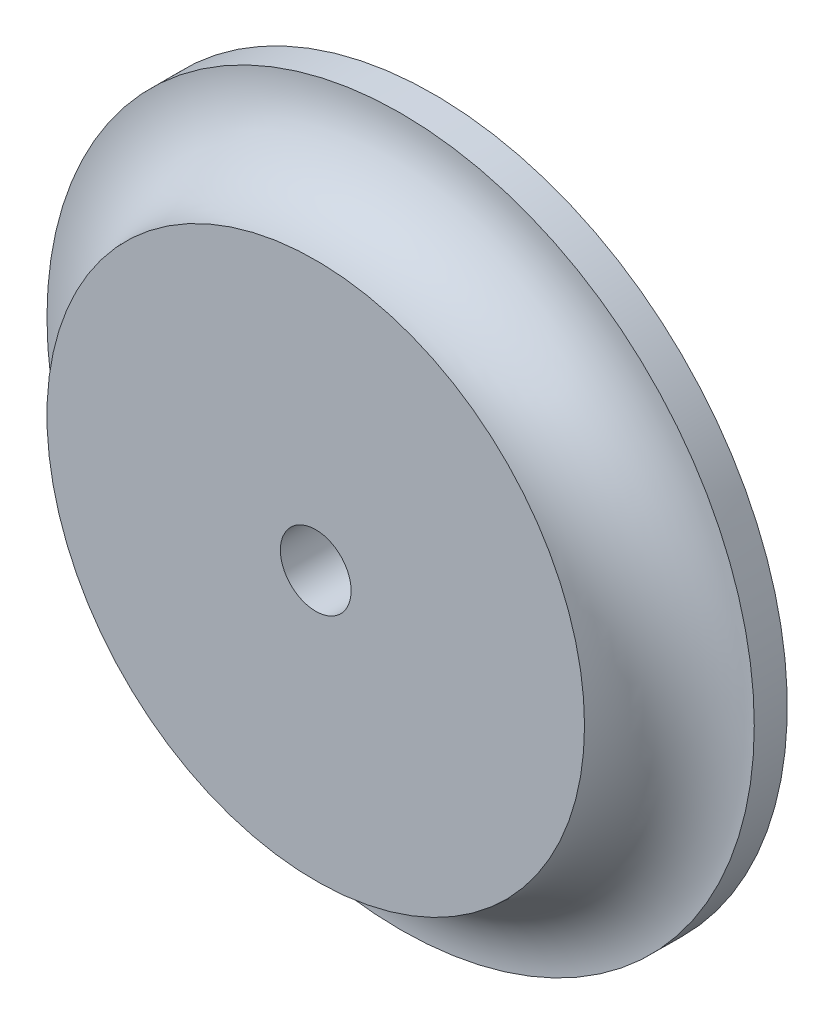
ISO-10303-21;
HEADER;
FILE_DESCRIPTION(('STEP AP214'),'2;1');
FILE_NAME('part.step','',(''),(''),'','','');
FILE_SCHEMA(('AUTOMOTIVE_DESIGN { 1 0 10303 214 1 1 1 1 }'));
ENDSEC;
DATA;
#1=APPLICATION_CONTEXT('core data for automotive mechanical design processes');
#2=APPLICATION_PROTOCOL_DEFINITION('international standard','automotive_design',2000,#1);
#3=PRODUCT_CONTEXT('',#1,'mechanical');
#4=PRODUCT('Part','Part','',(#3));
#5=PRODUCT_RELATED_PRODUCT_CATEGORY('part','',(#4));
#6=PRODUCT_DEFINITION_FORMATION('','',#4);
#7=PRODUCT_DEFINITION_CONTEXT('part definition',#1,'design');
#8=PRODUCT_DEFINITION('design','',#6,#7);
#9=PRODUCT_DEFINITION_SHAPE('','',#8);
#10=(LENGTH_UNIT() NAMED_UNIT(*) SI_UNIT(.MILLI.,.METRE.));
#11=(NAMED_UNIT(*) PLANE_ANGLE_UNIT() SI_UNIT($,.RADIAN.));
#12=(NAMED_UNIT(*) SI_UNIT($,.STERADIAN.) SOLID_ANGLE_UNIT());
#13=UNCERTAINTY_MEASURE_WITH_UNIT(LENGTH_MEASURE(1.E-05),#10,'distance_accuracy_value','');
#14=(GEOMETRIC_REPRESENTATION_CONTEXT(3) GLOBAL_UNCERTAINTY_ASSIGNED_CONTEXT((#13)) GLOBAL_UNIT_ASSIGNED_CONTEXT((#10,
#11,#12)) REPRESENTATION_CONTEXT('',''));
#15=CARTESIAN_POINT('',(0.,0.,0.));
#16=DIRECTION('',(0.,0.,1.));
#17=DIRECTION('',(1.,0.,0.));
#18=AXIS2_PLACEMENT_3D('',#15,#16,#17);
#19=CARTESIAN_POINT('',(0.,0.,-9.144));
#20=DIRECTION('',(0.,0.,1.));
#21=DIRECTION('',(1.,0.,0.));
#22=AXIS2_PLACEMENT_3D('',#19,#20,#21);
#23=TOROIDAL_SURFACE('',#22,38.1,9.144);
#24=CARTESIAN_POINT('',(0.,0.,-9.144));
#25=DIRECTION('',(0.,0.,1.));
#26=DIRECTION('',(1.,0.,0.));
#27=AXIS2_PLACEMENT_3D('',#24,#25,#26);
#28=CIRCLE('',#27,28.956);
#29=CARTESIAN_POINT('',(28.956,0.,-9.144));
#30=VERTEX_POINT('',#29);
#31=EDGE_CURVE('E59',#30,#30,#28,.F.);
#32=ORIENTED_EDGE('',*,*,#31,.T.);
#33=EDGE_LOOP('',(#32));
#34=FACE_BOUND('',#33,.T.);
#35=CARTESIAN_POINT('',(0.,0.,-18.288));
#36=DIRECTION('',(0.,0.,-1.));
#37=DIRECTION('',(-1.,0.,0.));
#38=AXIS2_PLACEMENT_3D('',#35,#36,#37);
#39=CIRCLE('',#38,38.1);
#40=CARTESIAN_POINT('',(-38.1,0.,-18.288));
#41=VERTEX_POINT('',#40);
#42=EDGE_CURVE('E48',#41,#41,#39,.T.);
#43=ORIENTED_EDGE('',*,*,#42,.F.);
#44=EDGE_LOOP('',(#43));
#45=FACE_BOUND('',#44,.T.);
#46=ADVANCED_FACE('F40',(#34,#45),#23,.F.);
#47=CARTESIAN_POINT('',(0.,0.,-21.844));
#48=DIRECTION('',(0.,0.,1.));
#49=DIRECTION('',(1.,0.,0.));
#50=AXIS2_PLACEMENT_3D('',#47,#48,#49);
#51=CYLINDRICAL_SURFACE('',#50,38.1);
#52=CARTESIAN_POINT('',(0.,0.,-21.844));
#53=DIRECTION('',(0.,0.,-1.));
#54=DIRECTION('',(-1.,0.,0.));
#55=AXIS2_PLACEMENT_3D('',#52,#53,#54);
#56=CIRCLE('',#55,38.1);
#57=CARTESIAN_POINT('',(-38.1,0.,-21.844));
#58=VERTEX_POINT('',#57);
#59=EDGE_CURVE('E10',#58,#58,#56,.T.);
#60=ORIENTED_EDGE('',*,*,#59,.F.);
#61=EDGE_LOOP('',(#60));
#62=FACE_BOUND('',#61,.T.);
#63=ORIENTED_EDGE('',*,*,#42,.T.);
#64=EDGE_LOOP('',(#63));
#65=FACE_BOUND('',#64,.T.);
#66=ADVANCED_FACE('F82',(#62,#65),#51,.T.);
#67=CARTESIAN_POINT('',(0.,0.,-21.844));
#68=DIRECTION('',(0.,0.,-1.));
#69=DIRECTION('',(-1.,0.,0.));
#70=AXIS2_PLACEMENT_3D('',#67,#68,#69);
#71=PLANE('',#70);
#72=CARTESIAN_POINT('',(0.,0.,-21.844));
#73=DIRECTION('',(0.,0.,1.));
#74=DIRECTION('',(1.,0.,0.));
#75=AXIS2_PLACEMENT_3D('',#72,#73,#74);
#76=CIRCLE('',#75,3.81);
#77=CARTESIAN_POINT('',(3.81,0.,-21.844));
#78=VERTEX_POINT('',#77);
#79=EDGE_CURVE('E54',#78,#78,#76,.T.);
#80=ORIENTED_EDGE('',*,*,#79,.T.);
#81=EDGE_LOOP('',(#80));
#82=FACE_BOUND('',#81,.T.);
#83=ORIENTED_EDGE('',*,*,#59,.T.);
#84=EDGE_LOOP('',(#83));
#85=FACE_BOUND('',#84,.T.);
#86=ADVANCED_FACE('F79',(#82,#85),#71,.T.);
#87=CARTESIAN_POINT('',(0.,0.,3.556));
#88=DIRECTION('',(0.,0.,1.));
#89=DIRECTION('',(1.,0.,0.));
#90=AXIS2_PLACEMENT_3D('',#87,#88,#89);
#91=CYLINDRICAL_SURFACE('',#90,3.81);
#92=CARTESIAN_POINT('',(0.,0.,-9.144));
#93=DIRECTION('',(0.,0.,-1.));
#94=DIRECTION('',(-1.,0.,0.));
#95=AXIS2_PLACEMENT_3D('',#92,#93,#94);
#96=CIRCLE('',#95,3.81);
#97=CARTESIAN_POINT('',(-3.81,0.,-9.144));
#98=VERTEX_POINT('',#97);
#99=EDGE_CURVE('E43',#98,#98,#96,.F.);
#100=ORIENTED_EDGE('',*,*,#99,.T.);
#101=EDGE_LOOP('',(#100));
#102=FACE_BOUND('',#101,.T.);
#103=ORIENTED_EDGE('',*,*,#79,.F.);
#104=EDGE_LOOP('',(#103));
#105=FACE_BOUND('',#104,.T.);
#106=ADVANCED_FACE('F68',(#102,#105),#91,.F.);
#107=CARTESIAN_POINT('',(-38.1,-38.1,-9.144));
#108=DIRECTION('',(0.,0.,-1.));
#109=DIRECTION('',(-1.,0.,0.));
#110=AXIS2_PLACEMENT_3D('',#107,#108,#109);
#111=PLANE('',#110);
#112=ORIENTED_EDGE('',*,*,#99,.F.);
#113=EDGE_LOOP('',(#112));
#114=FACE_BOUND('',#113,.T.);
#115=ORIENTED_EDGE('',*,*,#31,.F.);
#116=EDGE_LOOP('',(#115));
#117=FACE_BOUND('',#116,.T.);
#118=ADVANCED_FACE('F71',(#114,#117),#111,.F.);
#119=CLOSED_SHELL('',(#46,#66,#86,#106,#118));
#120=MANIFOLD_SOLID_BREP('B2',#119);
#121=ADVANCED_BREP_SHAPE_REPRESENTATION('',(#18,#120),#14);
#122=SHAPE_DEFINITION_REPRESENTATION(#9,#121);
ENDSEC;
END-ISO-10303-21;
